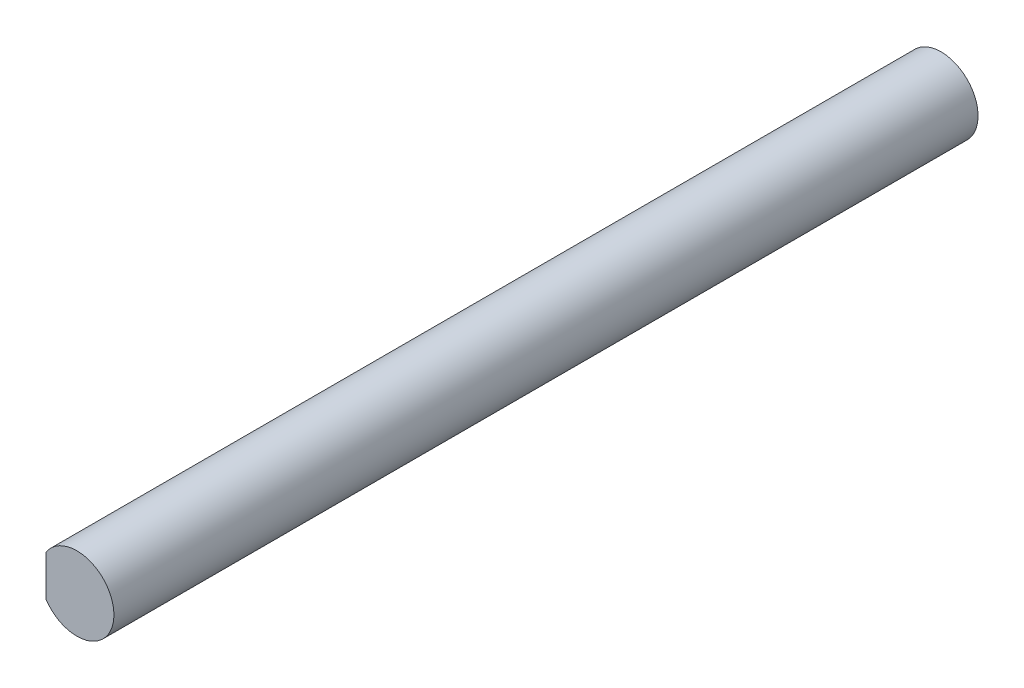
ISO-10303-21;
HEADER;
FILE_DESCRIPTION(('STEP AP214'),'2;1');
FILE_NAME('part.step','',(''),(''),'','','');
FILE_SCHEMA(('AUTOMOTIVE_DESIGN { 1 0 10303 214 1 1 1 1 }'));
ENDSEC;
DATA;
#1=APPLICATION_CONTEXT('core data for automotive mechanical design processes');
#2=APPLICATION_PROTOCOL_DEFINITION('international standard','automotive_design',2000,#1);
#3=PRODUCT_CONTEXT('',#1,'mechanical');
#4=PRODUCT('Part','Part','',(#3));
#5=PRODUCT_RELATED_PRODUCT_CATEGORY('part','',(#4));
#6=PRODUCT_DEFINITION_FORMATION('','',#4);
#7=PRODUCT_DEFINITION_CONTEXT('part definition',#1,'design');
#8=PRODUCT_DEFINITION('design','',#6,#7);
#9=PRODUCT_DEFINITION_SHAPE('','',#8);
#10=(LENGTH_UNIT() NAMED_UNIT(*) SI_UNIT(.MILLI.,.METRE.));
#11=(NAMED_UNIT(*) PLANE_ANGLE_UNIT() SI_UNIT($,.RADIAN.));
#12=(NAMED_UNIT(*) SI_UNIT($,.STERADIAN.) SOLID_ANGLE_UNIT());
#13=UNCERTAINTY_MEASURE_WITH_UNIT(LENGTH_MEASURE(1.E-05),#10,'distance_accuracy_value','');
#14=(GEOMETRIC_REPRESENTATION_CONTEXT(3) GLOBAL_UNCERTAINTY_ASSIGNED_CONTEXT((#13)) GLOBAL_UNIT_ASSIGNED_CONTEXT((#10,
#11,#12)) REPRESENTATION_CONTEXT('',''));
#15=CARTESIAN_POINT('',(0.,0.,0.));
#16=DIRECTION('',(0.,0.,1.));
#17=DIRECTION('',(1.,0.,0.));
#18=AXIS2_PLACEMENT_3D('',#15,#16,#17);
#19=CARTESIAN_POINT('',(0.,0.,70.));
#20=DIRECTION('',(0.,0.,-1.));
#21=DIRECTION('',(-1.,0.,0.));
#22=AXIS2_PLACEMENT_3D('',#19,#20,#21);
#23=CYLINDRICAL_SURFACE('',#22,3.);
#24=CARTESIAN_POINT('',(0.,0.,0.));
#25=DIRECTION('',(0.,0.,1.));
#26=DIRECTION('',(1.,0.,0.));
#27=AXIS2_PLACEMENT_3D('',#24,#25,#26);
#28=CIRCLE('',#27,3.);
#29=CARTESIAN_POINT('',(-2.5,-1.6583123951777,0.));
#30=VERTEX_POINT('',#29);
#31=CARTESIAN_POINT('',(-2.5,1.6583123951777,0.));
#32=VERTEX_POINT('',#31);
#33=EDGE_CURVE('E72',#30,#32,#28,.T.);
#34=ORIENTED_EDGE('',*,*,#33,.T.);
#35=DIRECTION('',(0.,0.,-1.));
#36=VECTOR('',#35,1.);
#37=CARTESIAN_POINT('',(-2.5,1.6583123951777,70.));
#38=LINE('',#37,#36);
#39=CARTESIAN_POINT('',(-2.5,1.6583123951777,70.));
#40=VERTEX_POINT('',#39);
#41=EDGE_CURVE('E11',#40,#32,#38,.T.);
#42=ORIENTED_EDGE('',*,*,#41,.F.);
#43=CARTESIAN_POINT('',(0.,0.,70.));
#44=DIRECTION('',(0.,0.,1.));
#45=DIRECTION('',(1.,0.,0.));
#46=AXIS2_PLACEMENT_3D('',#43,#44,#45);
#47=CIRCLE('',#46,3.);
#48=CARTESIAN_POINT('',(-2.5,-1.6583123951777,70.));
#49=VERTEX_POINT('',#48);
#50=EDGE_CURVE('E71',#49,#40,#47,.T.);
#51=ORIENTED_EDGE('',*,*,#50,.F.);
#52=DIRECTION('',(0.,0.,-1.));
#53=VECTOR('',#52,1.);
#54=CARTESIAN_POINT('',(-2.5,-1.6583123951777,70.));
#55=LINE('',#54,#53);
#56=EDGE_CURVE('E48',#49,#30,#55,.T.);
#57=ORIENTED_EDGE('',*,*,#56,.T.);
#58=EDGE_LOOP('',(#34,#42,#51,#57));
#59=FACE_BOUND('',#58,.T.);
#60=ADVANCED_FACE('F39',(#59),#23,.T.);
#61=CARTESIAN_POINT('',(-2.5,1.6583123951777,70.));
#62=DIRECTION('',(1.,0.,0.));
#63=DIRECTION('',(0.,0.,-1.));
#64=AXIS2_PLACEMENT_3D('',#61,#62,#63);
#65=PLANE('',#64);
#66=DIRECTION('',(0.,-1.,0.));
#67=VECTOR('',#66,1.);
#68=CARTESIAN_POINT('',(-2.5,1.6583123951777,0.));
#69=LINE('',#68,#67);
#70=EDGE_CURVE('E63',#32,#30,#69,.T.);
#71=ORIENTED_EDGE('',*,*,#70,.T.);
#72=ORIENTED_EDGE('',*,*,#56,.F.);
#73=DIRECTION('',(0.,-1.,0.));
#74=VECTOR('',#73,1.);
#75=CARTESIAN_POINT('',(-2.5,1.6583123951777,70.));
#76=LINE('',#75,#74);
#77=EDGE_CURVE('E55',#40,#49,#76,.T.);
#78=ORIENTED_EDGE('',*,*,#77,.F.);
#79=ORIENTED_EDGE('',*,*,#41,.T.);
#80=EDGE_LOOP('',(#71,#72,#78,#79));
#81=FACE_BOUND('',#80,.T.);
#82=ADVANCED_FACE('F66',(#81),#65,.F.);
#83=CARTESIAN_POINT('',(0.,0.,70.));
#84=DIRECTION('',(0.,0.,1.));
#85=DIRECTION('',(1.,0.,0.));
#86=AXIS2_PLACEMENT_3D('',#83,#84,#85);
#87=PLANE('',#86);
#88=ORIENTED_EDGE('',*,*,#50,.T.);
#89=ORIENTED_EDGE('',*,*,#77,.T.);
#90=EDGE_LOOP('',(#88,#89));
#91=FACE_BOUND('',#90,.T.);
#92=ADVANCED_FACE('F83',(#91),#87,.T.);
#93=CARTESIAN_POINT('',(0.,0.,0.));
#94=DIRECTION('',(0.,0.,1.));
#95=DIRECTION('',(1.,0.,0.));
#96=AXIS2_PLACEMENT_3D('',#93,#94,#95);
#97=PLANE('',#96);
#98=ORIENTED_EDGE('',*,*,#33,.F.);
#99=ORIENTED_EDGE('',*,*,#70,.F.);
#100=EDGE_LOOP('',(#98,#99));
#101=FACE_BOUND('',#100,.T.);
#102=ADVANCED_FACE('F76',(#101),#97,.F.);
#103=CLOSED_SHELL('',(#60,#82,#92,#102));
#104=MANIFOLD_SOLID_BREP('B2',#103);
#105=ADVANCED_BREP_SHAPE_REPRESENTATION('',(#18,#104),#14);
#106=SHAPE_DEFINITION_REPRESENTATION(#9,#105);
ENDSEC;
END-ISO-10303-21;
